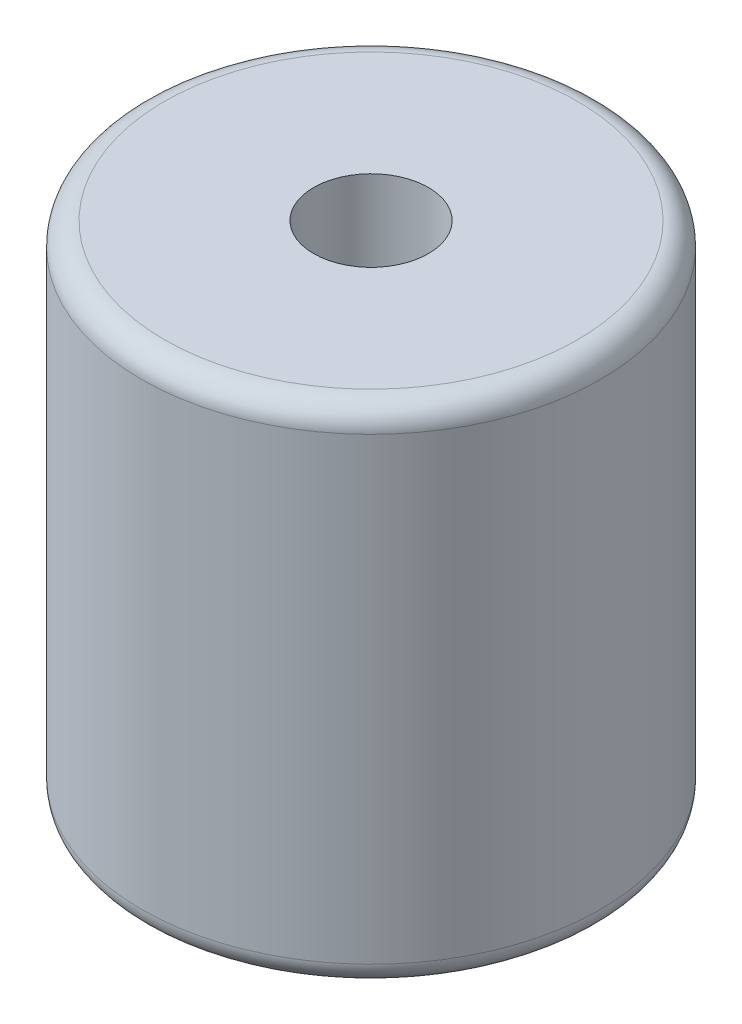
ISO-10303-21;
HEADER;
FILE_DESCRIPTION(('STEP AP214'),'2;1');
FILE_NAME('part.step','',(''),(''),'','','');
FILE_SCHEMA(('AUTOMOTIVE_DESIGN { 1 0 10303 214 1 1 1 1 }'));
ENDSEC;
DATA;
#1=APPLICATION_CONTEXT('core data for automotive mechanical design processes');
#2=APPLICATION_PROTOCOL_DEFINITION('international standard','automotive_design',2000,#1);
#3=PRODUCT_CONTEXT('',#1,'mechanical');
#4=PRODUCT('Part','Part','',(#3));
#5=PRODUCT_RELATED_PRODUCT_CATEGORY('part','',(#4));
#6=PRODUCT_DEFINITION_FORMATION('','',#4);
#7=PRODUCT_DEFINITION_CONTEXT('part definition',#1,'design');
#8=PRODUCT_DEFINITION('design','',#6,#7);
#9=PRODUCT_DEFINITION_SHAPE('','',#8);
#10=(LENGTH_UNIT() NAMED_UNIT(*) SI_UNIT(.MILLI.,.METRE.));
#11=(NAMED_UNIT(*) PLANE_ANGLE_UNIT() SI_UNIT($,.RADIAN.));
#12=(NAMED_UNIT(*) SI_UNIT($,.STERADIAN.) SOLID_ANGLE_UNIT());
#13=UNCERTAINTY_MEASURE_WITH_UNIT(LENGTH_MEASURE(1.E-05),#10,'distance_accuracy_value','');
#14=(GEOMETRIC_REPRESENTATION_CONTEXT(3) GLOBAL_UNCERTAINTY_ASSIGNED_CONTEXT((#13)) GLOBAL_UNIT_ASSIGNED_CONTEXT((#10,
#11,#12)) REPRESENTATION_CONTEXT('',''));
#15=CARTESIAN_POINT('',(0.,0.,0.));
#16=DIRECTION('',(0.,0.,1.));
#17=DIRECTION('',(1.,0.,0.));
#18=AXIS2_PLACEMENT_3D('',#15,#16,#17);
#19=CARTESIAN_POINT('',(0.,-22.,0.));
#20=DIRECTION('',(0.,1.,0.));
#21=DIRECTION('',(0.,0.,1.));
#22=AXIS2_PLACEMENT_3D('',#19,#20,#21);
#23=CYLINDRICAL_SURFACE('',#22,10.);
#24=CARTESIAN_POINT('',(0.,-21.,0.));
#25=DIRECTION('',(0.,1.,0.));
#26=DIRECTION('',(0.,0.,1.));
#27=AXIS2_PLACEMENT_3D('',#24,#25,#26);
#28=CIRCLE('',#27,10.);
#29=CARTESIAN_POINT('',(0.,-21.,10.));
#30=VERTEX_POINT('',#29);
#31=EDGE_CURVE('E22',#30,#30,#28,.T.);
#32=ORIENTED_EDGE('',*,*,#31,.T.);
#33=EDGE_LOOP('',(#32));
#34=FACE_BOUND('',#33,.T.);
#35=CARTESIAN_POINT('',(0.,-1.,0.));
#36=DIRECTION('',(0.,1.,0.));
#37=DIRECTION('',(0.,0.,1.));
#38=AXIS2_PLACEMENT_3D('',#35,#36,#37);
#39=CIRCLE('',#38,10.);
#40=CARTESIAN_POINT('',(0.,-1.,10.));
#41=VERTEX_POINT('',#40);
#42=EDGE_CURVE('E28',#41,#41,#39,.F.);
#43=ORIENTED_EDGE('',*,*,#42,.T.);
#44=EDGE_LOOP('',(#43));
#45=FACE_BOUND('',#44,.T.);
#46=ADVANCED_FACE('F14',(#34,#45),#23,.T.);
#47=CARTESIAN_POINT('',(0.,-22.,0.));
#48=DIRECTION('',(0.,1.,0.));
#49=DIRECTION('',(0.,0.,1.));
#50=AXIS2_PLACEMENT_3D('',#47,#48,#49);
#51=PLANE('',#50);
#52=CARTESIAN_POINT('',(0.,-22.,0.));
#53=DIRECTION('',(0.,1.,0.));
#54=DIRECTION('',(0.,0.,1.));
#55=AXIS2_PLACEMENT_3D('',#52,#53,#54);
#56=CIRCLE('',#55,7.);
#57=CARTESIAN_POINT('',(0.,-22.,7.));
#58=VERTEX_POINT('',#57);
#59=EDGE_CURVE('E39',#58,#58,#56,.T.);
#60=ORIENTED_EDGE('',*,*,#59,.T.);
#61=EDGE_LOOP('',(#60));
#62=FACE_BOUND('',#61,.T.);
#63=CARTESIAN_POINT('',(0.,-22.,0.));
#64=DIRECTION('',(0.,1.,0.));
#65=DIRECTION('',(0.,0.,1.));
#66=AXIS2_PLACEMENT_3D('',#63,#64,#65);
#67=CIRCLE('',#66,9.);
#68=CARTESIAN_POINT('',(0.,-22.,9.));
#69=VERTEX_POINT('',#68);
#70=EDGE_CURVE('E43',#69,#69,#67,.F.);
#71=ORIENTED_EDGE('',*,*,#70,.T.);
#72=EDGE_LOOP('',(#71));
#73=FACE_BOUND('',#72,.T.);
#74=ADVANCED_FACE('F76',(#62,#73),#51,.F.);
#75=CARTESIAN_POINT('',(0.,0.,0.));
#76=DIRECTION('',(0.,1.,0.));
#77=DIRECTION('',(0.,0.,1.));
#78=AXIS2_PLACEMENT_3D('',#75,#76,#77);
#79=PLANE('',#78);
#80=CARTESIAN_POINT('',(0.,0.,0.));
#81=DIRECTION('',(0.,1.,0.));
#82=DIRECTION('',(0.,0.,1.));
#83=AXIS2_PLACEMENT_3D('',#80,#81,#82);
#84=CIRCLE('',#83,9.);
#85=CARTESIAN_POINT('',(0.,0.,9.));
#86=VERTEX_POINT('',#85);
#87=EDGE_CURVE('E10',#86,#86,#84,.T.);
#88=ORIENTED_EDGE('',*,*,#87,.T.);
#89=EDGE_LOOP('',(#88));
#90=FACE_BOUND('',#89,.T.);
#91=CARTESIAN_POINT('',(0.,0.,0.));
#92=DIRECTION('',(0.,1.,0.));
#93=DIRECTION('',(0.,0.,1.));
#94=AXIS2_PLACEMENT_3D('',#91,#92,#93);
#95=CIRCLE('',#94,2.5);
#96=CARTESIAN_POINT('',(0.,0.,2.5));
#97=VERTEX_POINT('',#96);
#98=EDGE_CURVE('E47',#97,#97,#95,.T.);
#99=ORIENTED_EDGE('',*,*,#98,.F.);
#100=EDGE_LOOP('',(#99));
#101=FACE_BOUND('',#100,.T.);
#102=ADVANCED_FACE('F71',(#90,#101),#79,.T.);
#103=CARTESIAN_POINT('',(0.,-22.,0.));
#104=DIRECTION('',(0.,1.,0.));
#105=DIRECTION('',(0.,0.,1.));
#106=AXIS2_PLACEMENT_3D('',#103,#104,#105);
#107=CYLINDRICAL_SURFACE('',#106,2.5);
#108=CARTESIAN_POINT('',(0.,-12.,0.));
#109=DIRECTION('',(0.,1.,0.));
#110=DIRECTION('',(0.,0.,1.));
#111=AXIS2_PLACEMENT_3D('',#108,#109,#110);
#112=CIRCLE('',#111,2.5);
#113=CARTESIAN_POINT('',(0.,-12.,2.5));
#114=VERTEX_POINT('',#113);
#115=EDGE_CURVE('E48',#114,#114,#112,.F.);
#116=ORIENTED_EDGE('',*,*,#115,.T.);
#117=EDGE_LOOP('',(#116));
#118=FACE_BOUND('',#117,.T.);
#119=ORIENTED_EDGE('',*,*,#98,.T.);
#120=EDGE_LOOP('',(#119));
#121=FACE_BOUND('',#120,.T.);
#122=ADVANCED_FACE('F65',(#118,#121),#107,.F.);
#123=CARTESIAN_POINT('',(0.,-12.,0.));
#124=DIRECTION('',(0.,1.,0.));
#125=DIRECTION('',(0.,0.,1.));
#126=AXIS2_PLACEMENT_3D('',#123,#124,#125);
#127=PLANE('',#126);
#128=CARTESIAN_POINT('',(0.,-12.,0.));
#129=DIRECTION('',(0.,1.,0.));
#130=DIRECTION('',(0.,0.,1.));
#131=AXIS2_PLACEMENT_3D('',#128,#129,#130);
#132=CIRCLE('',#131,6.);
#133=CARTESIAN_POINT('',(0.,-12.,6.));
#134=VERTEX_POINT('',#133);
#135=EDGE_CURVE('E52',#134,#134,#132,.T.);
#136=ORIENTED_EDGE('',*,*,#135,.F.);
#137=EDGE_LOOP('',(#136));
#138=FACE_BOUND('',#137,.T.);
#139=ORIENTED_EDGE('',*,*,#115,.F.);
#140=EDGE_LOOP('',(#139));
#141=FACE_BOUND('',#140,.T.);
#142=ADVANCED_FACE('F62',(#138,#141),#127,.F.);
#143=CARTESIAN_POINT('',(0.,-22.,0.));
#144=DIRECTION('',(0.,1.,0.));
#145=DIRECTION('',(0.,0.,1.));
#146=AXIS2_PLACEMENT_3D('',#143,#144,#145);
#147=CYLINDRICAL_SURFACE('',#146,6.);
#148=CARTESIAN_POINT('',(0.,-21.,0.));
#149=DIRECTION('',(0.,1.,0.));
#150=DIRECTION('',(0.,0.,1.));
#151=AXIS2_PLACEMENT_3D('',#148,#149,#150);
#152=CIRCLE('',#151,6.);
#153=CARTESIAN_POINT('',(0.,-21.,6.));
#154=VERTEX_POINT('',#153);
#155=EDGE_CURVE('E33',#154,#154,#152,.F.);
#156=ORIENTED_EDGE('',*,*,#155,.T.);
#157=EDGE_LOOP('',(#156));
#158=FACE_BOUND('',#157,.T.);
#159=ORIENTED_EDGE('',*,*,#135,.T.);
#160=EDGE_LOOP('',(#159));
#161=FACE_BOUND('',#160,.T.);
#162=ADVANCED_FACE('F60',(#158,#161),#147,.F.);
#163=CARTESIAN_POINT('',(0.,-21.,0.));
#164=DIRECTION('',(0.,1.,0.));
#165=DIRECTION('',(0.,0.,1.));
#166=AXIS2_PLACEMENT_3D('',#163,#164,#165);
#167=TOROIDAL_SURFACE('',#166,7.,1.);
#168=ORIENTED_EDGE('',*,*,#155,.F.);
#169=EDGE_LOOP('',(#168));
#170=FACE_BOUND('',#169,.T.);
#171=ORIENTED_EDGE('',*,*,#59,.F.);
#172=EDGE_LOOP('',(#171));
#173=FACE_BOUND('',#172,.T.);
#174=ADVANCED_FACE('F92',(#170,#173),#167,.T.);
#175=CARTESIAN_POINT('',(0.,-21.,0.));
#176=DIRECTION('',(0.,1.,0.));
#177=DIRECTION('',(0.,0.,1.));
#178=AXIS2_PLACEMENT_3D('',#175,#176,#177);
#179=TOROIDAL_SURFACE('',#178,9.,1.);
#180=ORIENTED_EDGE('',*,*,#70,.F.);
#181=EDGE_LOOP('',(#180));
#182=FACE_BOUND('',#181,.T.);
#183=ORIENTED_EDGE('',*,*,#31,.F.);
#184=EDGE_LOOP('',(#183));
#185=FACE_BOUND('',#184,.T.);
#186=ADVANCED_FACE('F94',(#182,#185),#179,.T.);
#187=CARTESIAN_POINT('',(0.,-1.,0.));
#188=DIRECTION('',(0.,1.,0.));
#189=DIRECTION('',(0.,0.,1.));
#190=AXIS2_PLACEMENT_3D('',#187,#188,#189);
#191=TOROIDAL_SURFACE('',#190,9.,1.);
#192=ORIENTED_EDGE('',*,*,#42,.F.);
#193=EDGE_LOOP('',(#192));
#194=FACE_BOUND('',#193,.T.);
#195=ORIENTED_EDGE('',*,*,#87,.F.);
#196=EDGE_LOOP('',(#195));
#197=FACE_BOUND('',#196,.T.);
#198=ADVANCED_FACE('F16',(#194,#197),#191,.T.);
#199=CLOSED_SHELL('',(#46,#74,#102,#122,#142,#162,#174,#186,#198));
#200=MANIFOLD_SOLID_BREP('B1',#199);
#201=ADVANCED_BREP_SHAPE_REPRESENTATION('',(#18,#200),#14);
#202=SHAPE_DEFINITION_REPRESENTATION(#9,#201);
ENDSEC;
END-ISO-10303-21;
